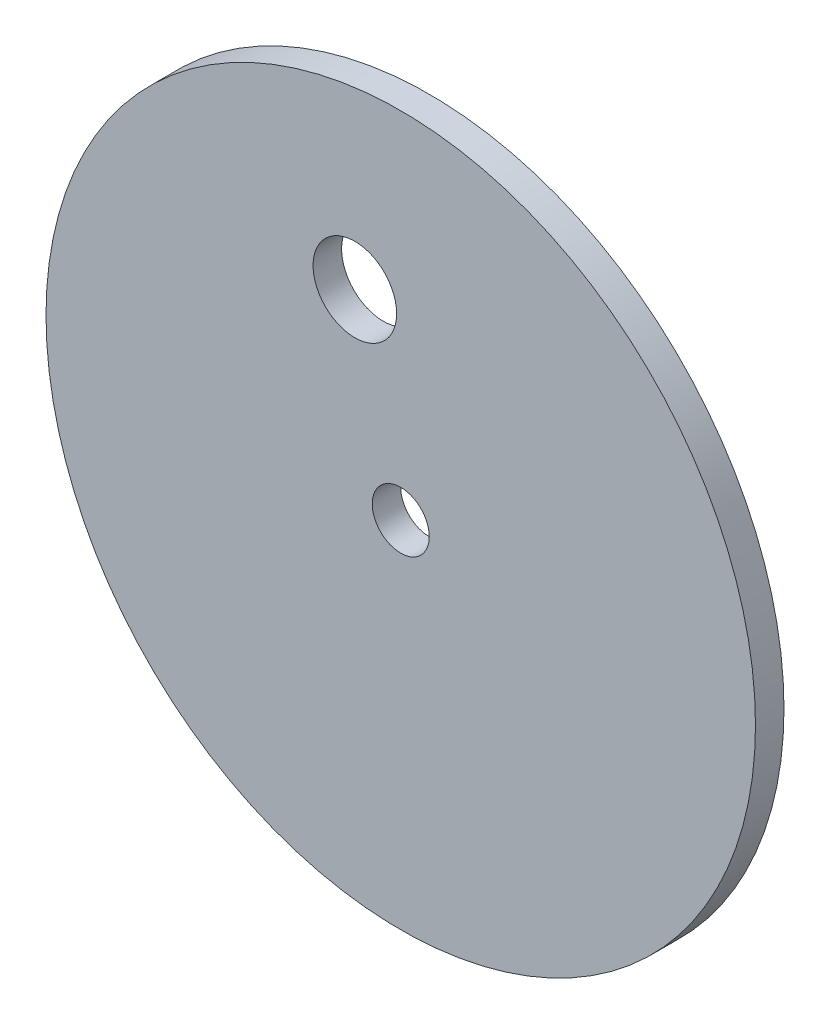
ISO-10303-21;
HEADER;
FILE_DESCRIPTION(('STEP AP214'),'2;1');
FILE_NAME('part.step','',(''),(''),'','','');
FILE_SCHEMA(('AUTOMOTIVE_DESIGN { 1 0 10303 214 1 1 1 1 }'));
ENDSEC;
DATA;
#1=APPLICATION_CONTEXT('core data for automotive mechanical design processes');
#2=APPLICATION_PROTOCOL_DEFINITION('international standard','automotive_design',2000,#1);
#3=PRODUCT_CONTEXT('',#1,'mechanical');
#4=PRODUCT('Part','Part','',(#3));
#5=PRODUCT_RELATED_PRODUCT_CATEGORY('part','',(#4));
#6=PRODUCT_DEFINITION_FORMATION('','',#4);
#7=PRODUCT_DEFINITION_CONTEXT('part definition',#1,'design');
#8=PRODUCT_DEFINITION('design','',#6,#7);
#9=PRODUCT_DEFINITION_SHAPE('','',#8);
#10=(LENGTH_UNIT() NAMED_UNIT(*) SI_UNIT(.MILLI.,.METRE.));
#11=(NAMED_UNIT(*) PLANE_ANGLE_UNIT() SI_UNIT($,.RADIAN.));
#12=(NAMED_UNIT(*) SI_UNIT($,.STERADIAN.) SOLID_ANGLE_UNIT());
#13=UNCERTAINTY_MEASURE_WITH_UNIT(LENGTH_MEASURE(1.E-05),#10,'distance_accuracy_value','');
#14=(GEOMETRIC_REPRESENTATION_CONTEXT(3) GLOBAL_UNCERTAINTY_ASSIGNED_CONTEXT((#13)) GLOBAL_UNIT_ASSIGNED_CONTEXT((#10,
#11,#12)) REPRESENTATION_CONTEXT('',''));
#15=CARTESIAN_POINT('',(0.,0.,0.));
#16=DIRECTION('',(0.,0.,1.));
#17=DIRECTION('',(1.,0.,0.));
#18=AXIS2_PLACEMENT_3D('',#15,#16,#17);
#19=CARTESIAN_POINT('',(0.,0.,10.));
#20=DIRECTION('',(0.,0.,1.));
#21=DIRECTION('',(1.,0.,0.));
#22=AXIS2_PLACEMENT_3D('',#19,#20,#21);
#23=PLANE('',#22);
#24=CARTESIAN_POINT('',(-16.0933504679368,62.0164272251309,10.));
#25=DIRECTION('',(0.,0.,1.));
#26=DIRECTION('',(1.,0.,0.));
#27=AXIS2_PLACEMENT_3D('',#24,#25,#26);
#28=CIRCLE('',#27,14.6495497382199);
#29=CARTESIAN_POINT('',(-1.44380072971689,62.0164272251309,10.));
#30=VERTEX_POINT('',#29);
#31=EDGE_CURVE('E42',#30,#30,#28,.T.);
#32=ORIENTED_EDGE('',*,*,#31,.F.);
#33=EDGE_LOOP('',(#32));
#34=FACE_BOUND('',#33,.T.);
#35=CARTESIAN_POINT('',(0.,0.,10.));
#36=DIRECTION('',(0.,0.,1.));
#37=DIRECTION('',(1.,0.,0.));
#38=AXIS2_PLACEMENT_3D('',#35,#36,#37);
#39=CIRCLE('',#38,124.4);
#40=CARTESIAN_POINT('',(124.4,0.,10.));
#41=VERTEX_POINT('',#40);
#42=EDGE_CURVE('E10',#41,#41,#39,.T.);
#43=ORIENTED_EDGE('',*,*,#42,.T.);
#44=EDGE_LOOP('',(#43));
#45=FACE_BOUND('',#44,.T.);
#46=CARTESIAN_POINT('',(0.,0.,10.));
#47=DIRECTION('',(0.,0.,1.));
#48=DIRECTION('',(1.,0.,0.));
#49=AXIS2_PLACEMENT_3D('',#46,#47,#48);
#50=CIRCLE('',#49,10.);
#51=CARTESIAN_POINT('',(10.,0.,10.));
#52=VERTEX_POINT('',#51);
#53=EDGE_CURVE('E47',#52,#52,#50,.T.);
#54=ORIENTED_EDGE('',*,*,#53,.F.);
#55=EDGE_LOOP('',(#54));
#56=FACE_BOUND('',#55,.T.);
#57=ADVANCED_FACE('F31',(#34,#45,#56),#23,.T.);
#58=CARTESIAN_POINT('',(0.,0.,0.));
#59=DIRECTION('',(0.,0.,1.));
#60=DIRECTION('',(1.,0.,0.));
#61=AXIS2_PLACEMENT_3D('',#58,#59,#60);
#62=PLANE('',#61);
#63=CARTESIAN_POINT('',(0.,0.,0.));
#64=DIRECTION('',(0.,0.,1.));
#65=DIRECTION('',(1.,0.,0.));
#66=AXIS2_PLACEMENT_3D('',#63,#64,#65);
#67=CIRCLE('',#66,124.4);
#68=CARTESIAN_POINT('',(124.4,0.,0.));
#69=VERTEX_POINT('',#68);
#70=EDGE_CURVE('E35',#69,#69,#67,.T.);
#71=ORIENTED_EDGE('',*,*,#70,.F.);
#72=EDGE_LOOP('',(#71));
#73=FACE_BOUND('',#72,.T.);
#74=CARTESIAN_POINT('',(-16.0933504679368,62.0164272251309,0.));
#75=DIRECTION('',(0.,0.,1.));
#76=DIRECTION('',(1.,0.,0.));
#77=AXIS2_PLACEMENT_3D('',#74,#75,#76);
#78=CIRCLE('',#77,14.6495497382199);
#79=CARTESIAN_POINT('',(-1.44380072971689,62.0164272251309,0.));
#80=VERTEX_POINT('',#79);
#81=EDGE_CURVE('E44',#80,#80,#78,.T.);
#82=ORIENTED_EDGE('',*,*,#81,.T.);
#83=EDGE_LOOP('',(#82));
#84=FACE_BOUND('',#83,.T.);
#85=CARTESIAN_POINT('',(0.,0.,0.));
#86=DIRECTION('',(0.,0.,1.));
#87=DIRECTION('',(1.,0.,0.));
#88=AXIS2_PLACEMENT_3D('',#85,#86,#87);
#89=CIRCLE('',#88,10.);
#90=CARTESIAN_POINT('',(10.,0.,0.));
#91=VERTEX_POINT('',#90);
#92=EDGE_CURVE('E50',#91,#91,#89,.T.);
#93=ORIENTED_EDGE('',*,*,#92,.T.);
#94=EDGE_LOOP('',(#93));
#95=FACE_BOUND('',#94,.T.);
#96=ADVANCED_FACE('F60',(#73,#84,#95),#62,.F.);
#97=CARTESIAN_POINT('',(0.,0.,10.));
#98=DIRECTION('',(0.,0.,-1.));
#99=DIRECTION('',(-1.,0.,0.));
#100=AXIS2_PLACEMENT_3D('',#97,#98,#99);
#101=CYLINDRICAL_SURFACE('',#100,124.4);
#102=ORIENTED_EDGE('',*,*,#42,.F.);
#103=EDGE_LOOP('',(#102));
#104=FACE_BOUND('',#103,.T.);
#105=ORIENTED_EDGE('',*,*,#70,.T.);
#106=EDGE_LOOP('',(#105));
#107=FACE_BOUND('',#106,.T.);
#108=ADVANCED_FACE('F33',(#104,#107),#101,.T.);
#109=CARTESIAN_POINT('',(-16.0933504679368,62.0164272251309,10.));
#110=DIRECTION('',(0.,0.,-1.));
#111=DIRECTION('',(-1.,0.,0.));
#112=AXIS2_PLACEMENT_3D('',#109,#110,#111);
#113=CYLINDRICAL_SURFACE('',#112,14.6495497382199);
#114=ORIENTED_EDGE('',*,*,#31,.T.);
#115=EDGE_LOOP('',(#114));
#116=FACE_BOUND('',#115,.T.);
#117=ORIENTED_EDGE('',*,*,#81,.F.);
#118=EDGE_LOOP('',(#117));
#119=FACE_BOUND('',#118,.T.);
#120=ADVANCED_FACE('F69',(#116,#119),#113,.F.);
#121=CARTESIAN_POINT('',(0.,0.,10.));
#122=DIRECTION('',(0.,0.,-1.));
#123=DIRECTION('',(-1.,0.,0.));
#124=AXIS2_PLACEMENT_3D('',#121,#122,#123);
#125=CYLINDRICAL_SURFACE('',#124,10.);
#126=ORIENTED_EDGE('',*,*,#53,.T.);
#127=EDGE_LOOP('',(#126));
#128=FACE_BOUND('',#127,.T.);
#129=ORIENTED_EDGE('',*,*,#92,.F.);
#130=EDGE_LOOP('',(#129));
#131=FACE_BOUND('',#130,.T.);
#132=ADVANCED_FACE('F56',(#128,#131),#125,.F.);
#133=CLOSED_SHELL('',(#57,#96,#108,#120,#132));
#134=MANIFOLD_SOLID_BREP('B2',#133);
#135=ADVANCED_BREP_SHAPE_REPRESENTATION('',(#18,#134),#14);
#136=SHAPE_DEFINITION_REPRESENTATION(#9,#135);
ENDSEC;
END-ISO-10303-21;
